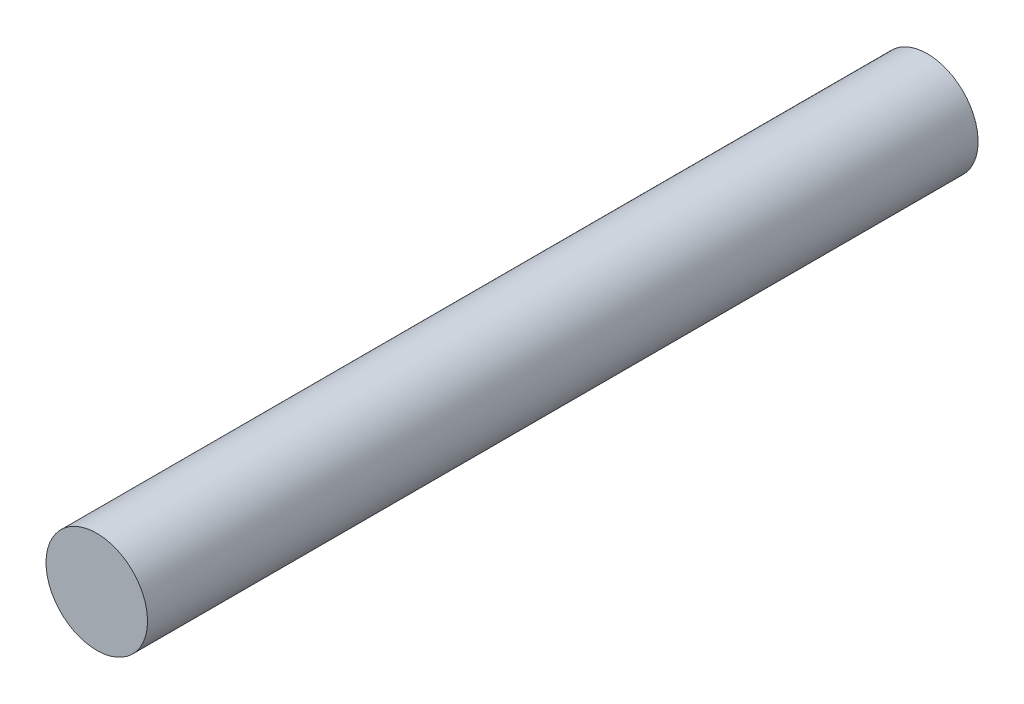
ISO-10303-21;
HEADER;
FILE_DESCRIPTION(('STEP AP214'),'2;1');
FILE_NAME('part.step','',(''),(''),'','','');
FILE_SCHEMA(('AUTOMOTIVE_DESIGN { 1 0 10303 214 1 1 1 1 }'));
ENDSEC;
DATA;
#1=APPLICATION_CONTEXT('core data for automotive mechanical design processes');
#2=APPLICATION_PROTOCOL_DEFINITION('international standard','automotive_design',2000,#1);
#3=PRODUCT_CONTEXT('',#1,'mechanical');
#4=PRODUCT('Part','Part','',(#3));
#5=PRODUCT_RELATED_PRODUCT_CATEGORY('part','',(#4));
#6=PRODUCT_DEFINITION_FORMATION('','',#4);
#7=PRODUCT_DEFINITION_CONTEXT('part definition',#1,'design');
#8=PRODUCT_DEFINITION('design','',#6,#7);
#9=PRODUCT_DEFINITION_SHAPE('','',#8);
#10=(LENGTH_UNIT() NAMED_UNIT(*) SI_UNIT(.MILLI.,.METRE.));
#11=(NAMED_UNIT(*) PLANE_ANGLE_UNIT() SI_UNIT($,.RADIAN.));
#12=(NAMED_UNIT(*) SI_UNIT($,.STERADIAN.) SOLID_ANGLE_UNIT());
#13=UNCERTAINTY_MEASURE_WITH_UNIT(LENGTH_MEASURE(1.E-05),#10,'distance_accuracy_value','');
#14=(GEOMETRIC_REPRESENTATION_CONTEXT(3) GLOBAL_UNCERTAINTY_ASSIGNED_CONTEXT((#13)) GLOBAL_UNIT_ASSIGNED_CONTEXT((#10,
#11,#12)) REPRESENTATION_CONTEXT('',''));
#15=CARTESIAN_POINT('',(0.,0.,0.));
#16=DIRECTION('',(0.,0.,1.));
#17=DIRECTION('',(1.,0.,0.));
#18=AXIS2_PLACEMENT_3D('',#15,#16,#17);
#19=CARTESIAN_POINT('',(0.,0.,45.));
#20=DIRECTION('',(0.,0.,-1.));
#21=DIRECTION('',(-1.,0.,0.));
#22=AXIS2_PLACEMENT_3D('',#19,#20,#21);
#23=CYLINDRICAL_SURFACE('',#22,2.75);
#24=CARTESIAN_POINT('',(0.,0.,45.));
#25=DIRECTION('',(0.,0.,1.));
#26=DIRECTION('',(1.,0.,0.));
#27=AXIS2_PLACEMENT_3D('',#24,#25,#26);
#28=CIRCLE('',#27,2.75);
#29=CARTESIAN_POINT('',(-2.75,0.,45.));
#30=VERTEX_POINT('',#29);
#31=EDGE_CURVE('E10',#30,#30,#28,.T.);
#32=CARTESIAN_POINT('',(0.,0.,0.));
#33=DIRECTION('',(0.,0.,1.));
#34=DIRECTION('',(1.,0.,0.));
#35=AXIS2_PLACEMENT_3D('',#32,#33,#34);
#36=CIRCLE('',#35,2.75);
#37=CARTESIAN_POINT('',(-2.75,0.,0.));
#38=VERTEX_POINT('',#37);
#39=EDGE_CURVE('E44',#38,#38,#36,.T.);
#40=CARTESIAN_POINT('',(-2.75,0.,45.));
#41=CARTESIAN_POINT('',(-2.75,0.,44.53125));
#42=CARTESIAN_POINT('',(-2.75,0.,44.0625));
#43=CARTESIAN_POINT('',(-2.75,0.,43.125));
#44=CARTESIAN_POINT('',(-2.75,0.,42.65625));
#45=CARTESIAN_POINT('',(-2.75,0.,41.71875));
#46=CARTESIAN_POINT('',(-2.75,0.,41.25));
#47=CARTESIAN_POINT('',(-2.75,0.,40.3125));
#48=CARTESIAN_POINT('',(-2.75,0.,39.84375));
#49=CARTESIAN_POINT('',(-2.75,0.,38.90625));
#50=CARTESIAN_POINT('',(-2.75,0.,38.4375));
#51=CARTESIAN_POINT('',(-2.75,0.,37.5));
#52=CARTESIAN_POINT('',(-2.75,0.,37.03125));
#53=CARTESIAN_POINT('',(-2.75,0.,36.09375));
#54=CARTESIAN_POINT('',(-2.75,0.,35.625));
#55=CARTESIAN_POINT('',(-2.75,0.,34.6875));
#56=CARTESIAN_POINT('',(-2.75,0.,34.21875));
#57=CARTESIAN_POINT('',(-2.75,0.,33.28125));
#58=CARTESIAN_POINT('',(-2.75,0.,32.8125));
#59=CARTESIAN_POINT('',(-2.75,0.,31.875));
#60=CARTESIAN_POINT('',(-2.75,0.,31.40625));
#61=CARTESIAN_POINT('',(-2.75,0.,30.46875));
#62=CARTESIAN_POINT('',(-2.75,0.,30.));
#63=CARTESIAN_POINT('',(-2.75,0.,29.0625));
#64=CARTESIAN_POINT('',(-2.75,0.,28.59375));
#65=CARTESIAN_POINT('',(-2.75,0.,27.65625));
#66=CARTESIAN_POINT('',(-2.75,0.,27.1875));
#67=CARTESIAN_POINT('',(-2.75,0.,26.25));
#68=CARTESIAN_POINT('',(-2.75,0.,25.78125));
#69=CARTESIAN_POINT('',(-2.75,0.,24.84375));
#70=CARTESIAN_POINT('',(-2.75,0.,24.375));
#71=CARTESIAN_POINT('',(-2.75,0.,23.4375));
#72=CARTESIAN_POINT('',(-2.75,0.,22.96875));
#73=CARTESIAN_POINT('',(-2.75,0.,22.03125));
#74=CARTESIAN_POINT('',(-2.75,0.,21.5625));
#75=CARTESIAN_POINT('',(-2.75,0.,20.625));
#76=CARTESIAN_POINT('',(-2.75,0.,20.15625));
#77=CARTESIAN_POINT('',(-2.75,0.,19.21875));
#78=CARTESIAN_POINT('',(-2.75,0.,18.75));
#79=CARTESIAN_POINT('',(-2.75,0.,17.8125));
#80=CARTESIAN_POINT('',(-2.75,0.,17.34375));
#81=CARTESIAN_POINT('',(-2.75,0.,16.40625));
#82=CARTESIAN_POINT('',(-2.75,0.,15.9375));
#83=CARTESIAN_POINT('',(-2.75,0.,15.));
#84=CARTESIAN_POINT('',(-2.75,0.,14.53125));
#85=CARTESIAN_POINT('',(-2.75,0.,13.59375));
#86=CARTESIAN_POINT('',(-2.75,0.,13.125));
#87=CARTESIAN_POINT('',(-2.75,0.,12.1875));
#88=CARTESIAN_POINT('',(-2.75,0.,11.71875));
#89=CARTESIAN_POINT('',(-2.75,0.,10.78125));
#90=CARTESIAN_POINT('',(-2.75,0.,10.3125));
#91=CARTESIAN_POINT('',(-2.75,0.,9.375));
#92=CARTESIAN_POINT('',(-2.75,0.,8.90625));
#93=CARTESIAN_POINT('',(-2.75,0.,7.96874999999999));
#94=CARTESIAN_POINT('',(-2.75,0.,7.5));
#95=CARTESIAN_POINT('',(-2.75,0.,6.5625));
#96=CARTESIAN_POINT('',(-2.75,0.,6.09375));
#97=CARTESIAN_POINT('',(-2.75,0.,5.15625));
#98=CARTESIAN_POINT('',(-2.75,0.,4.68749999999999));
#99=CARTESIAN_POINT('',(-2.75,0.,3.74999999999999));
#100=CARTESIAN_POINT('',(-2.75,0.,3.28124999999999));
#101=CARTESIAN_POINT('',(-2.75,0.,2.34374999999999));
#102=CARTESIAN_POINT('',(-2.75,0.,1.87499999999999));
#103=CARTESIAN_POINT('',(-2.75,0.,0.937499999999992));
#104=CARTESIAN_POINT('',(-2.75,0.,0.468749999999993));
#105=CARTESIAN_POINT('',(-2.75,0.,0.));
#106=B_SPLINE_CURVE_WITH_KNOTS('',3,(#40,#41,#42,#43,#44,#45,#46,#47,#48,#49,#50,#51,#52,#53,
#54,#55,#56,#57,#58,#59,#60,#61,#62,#63,#64,#65,#66,#67,#68,#69,#70,#71,#72,#73,#74,#75,#76,#77,
#78,#79,#80,#81,#82,#83,#84,#85,#86,#87,#88,#89,#90,#91,#92,#93,#94,#95,#96,#97,#98,#99,#100,
#101,#102,#103,#104,#105),.UNSPECIFIED.,.F.,.F.,(4,2,2,2,2,2,2,2,2,2,2,2,2,2,2,2,2,2,2,2,2,2,2,
2,2,2,2,2,2,2,2,2,4),(0.,1.40625,2.8125,4.21875000000001,5.62500000000001,7.03125,8.4375,
9.84375000000001,11.25,12.65625,14.0625,15.46875,16.875,18.28125,19.6875,21.09375,22.5,23.90625,
25.3125,26.71875,28.125,29.53125,30.9375,32.34375,33.75,35.15625,36.5625,37.96875,39.375,
40.78125,42.1875,43.59375,45.),.UNSPECIFIED.);
#107=EDGE_CURVE('BSEAM41',#30,#38,#106,.T.);
#108=ORIENTED_EDGE('',*,*,#31,.F.);
#109=ORIENTED_EDGE('',*,*,#39,.T.);
#110=ORIENTED_EDGE('',*,*,#107,.T.);
#111=ORIENTED_EDGE('',*,*,#107,.F.);
#112=EDGE_LOOP('',(#108,#110,#109,#111));
#113=FACE_BOUND('',#112,.T.);
#114=ADVANCED_FACE('F41',(#113),#23,.T.);
#115=CARTESIAN_POINT('',(0.,0.,45.));
#116=DIRECTION('',(0.,0.,1.));
#117=DIRECTION('',(1.,0.,0.));
#118=AXIS2_PLACEMENT_3D('',#115,#116,#117);
#119=PLANE('',#118);
#120=ORIENTED_EDGE('',*,*,#31,.T.);
#121=EDGE_LOOP('',(#120));
#122=FACE_BOUND('',#121,.T.);
#123=ADVANCED_FACE('F58',(#122),#119,.T.);
#124=CARTESIAN_POINT('',(0.,0.,0.));
#125=DIRECTION('',(0.,0.,1.));
#126=DIRECTION('',(1.,0.,0.));
#127=AXIS2_PLACEMENT_3D('',#124,#125,#126);
#128=PLANE('',#127);
#129=ORIENTED_EDGE('',*,*,#39,.F.);
#130=EDGE_LOOP('',(#129));
#131=FACE_BOUND('',#130,.T.);
#132=ADVANCED_FACE('F56',(#131),#128,.F.);
#133=CLOSED_SHELL('',(#114,#123,#132));
#134=MANIFOLD_SOLID_BREP('B2',#133);
#135=ADVANCED_BREP_SHAPE_REPRESENTATION('',(#18,#134),#14);
#136=SHAPE_DEFINITION_REPRESENTATION(#9,#135);
ENDSEC;
END-ISO-10303-21;
